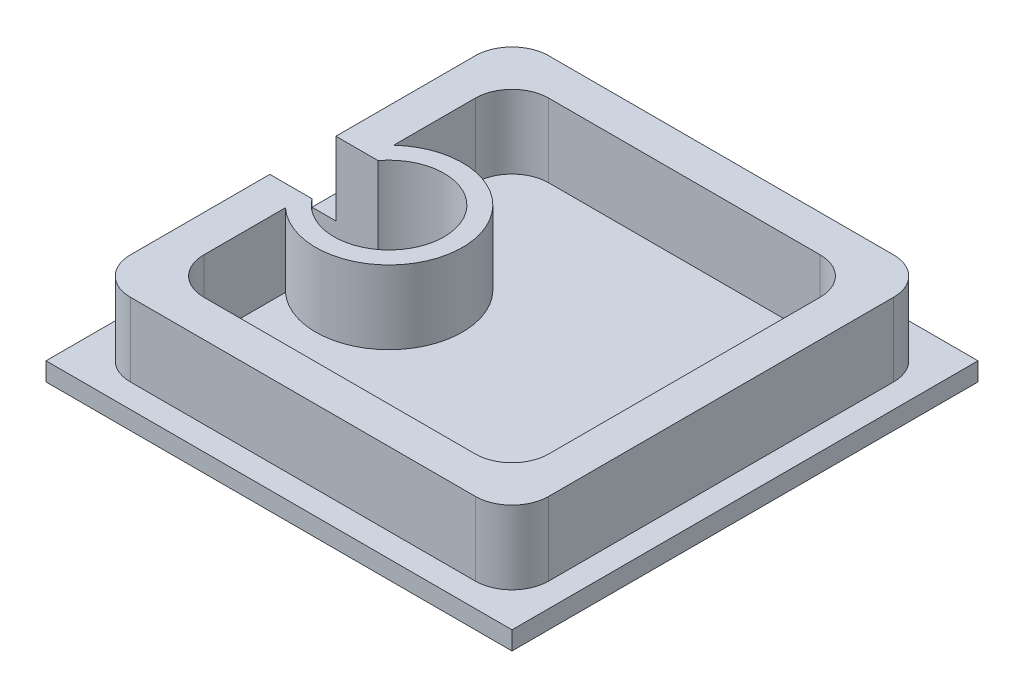
ISO-10303-21;
HEADER;
FILE_DESCRIPTION(('STEP AP214'),'2;1');
FILE_NAME('part.step','',(''),(''),'','','');
FILE_SCHEMA(('AUTOMOTIVE_DESIGN { 1 0 10303 214 1 1 1 1 }'));
ENDSEC;
DATA;
#1=APPLICATION_CONTEXT('core data for automotive mechanical design processes');
#2=APPLICATION_PROTOCOL_DEFINITION('international standard','automotive_design',2000,#1);
#3=PRODUCT_CONTEXT('',#1,'mechanical');
#4=PRODUCT('Part','Part','',(#3));
#5=PRODUCT_RELATED_PRODUCT_CATEGORY('part','',(#4));
#6=PRODUCT_DEFINITION_FORMATION('','',#4);
#7=PRODUCT_DEFINITION_CONTEXT('part definition',#1,'design');
#8=PRODUCT_DEFINITION('design','',#6,#7);
#9=PRODUCT_DEFINITION_SHAPE('','',#8);
#10=(LENGTH_UNIT() NAMED_UNIT(*) SI_UNIT(.MILLI.,.METRE.));
#11=(NAMED_UNIT(*) PLANE_ANGLE_UNIT() SI_UNIT($,.RADIAN.));
#12=(NAMED_UNIT(*) SI_UNIT($,.STERADIAN.) SOLID_ANGLE_UNIT());
#13=UNCERTAINTY_MEASURE_WITH_UNIT(LENGTH_MEASURE(1.E-05),#10,'distance_accuracy_value','');
#14=(GEOMETRIC_REPRESENTATION_CONTEXT(3) GLOBAL_UNCERTAINTY_ASSIGNED_CONTEXT((#13)) GLOBAL_UNIT_ASSIGNED_CONTEXT((#10,
#11,#12)) REPRESENTATION_CONTEXT('',''));
#15=CARTESIAN_POINT('',(0.,0.,0.));
#16=DIRECTION('',(0.,0.,1.));
#17=DIRECTION('',(1.,0.,0.));
#18=AXIS2_PLACEMENT_3D('',#15,#16,#17);
#19=CARTESIAN_POINT('',(-9.40000000000001,5.,-9.40000000000001));
#20=DIRECTION('',(1.,0.,0.));
#21=DIRECTION('',(0.,0.,-1.));
#22=AXIS2_PLACEMENT_3D('',#19,#20,#21);
#23=PLANE('',#22);
#24=DIRECTION('',(0.,0.,1.));
#25=VECTOR('',#24,1.);
#26=CARTESIAN_POINT('',(-9.40000000000001,5.,-9.40000000000001));
#27=LINE('',#26,#25);
#28=CARTESIAN_POINT('',(-9.40000000000001,5.,-7.40000000000001));
#29=VERTEX_POINT('',#28);
#30=CARTESIAN_POINT('',(-9.40000000000001,5.,-2.95127091267474));
#31=VERTEX_POINT('',#30);
#32=EDGE_CURVE('E280',#29,#31,#27,.T.);
#33=ORIENTED_EDGE('',*,*,#32,.T.);
#34=DIRECTION('',(0.,-1.,0.));
#35=VECTOR('',#34,1.);
#36=CARTESIAN_POINT('',(-9.40000000000001,15.435037134577,-2.95127091267474));
#37=LINE('',#36,#35);
#38=CARTESIAN_POINT('',(-9.40000000000001,1.,-2.95127091267474));
#39=VERTEX_POINT('',#38);
#40=EDGE_CURVE('E244',#31,#39,#37,.T.);
#41=ORIENTED_EDGE('',*,*,#40,.T.);
#42=DIRECTION('',(0.,0.,1.));
#43=VECTOR('',#42,1.);
#44=CARTESIAN_POINT('',(-9.40000000000001,1.,-9.40000000000001));
#45=LINE('',#44,#43);
#46=CARTESIAN_POINT('',(-9.40000000000001,1.,-7.40000000000001));
#47=VERTEX_POINT('',#46);
#48=EDGE_CURVE('E293',#47,#39,#45,.T.);
#49=ORIENTED_EDGE('',*,*,#48,.F.);
#50=DIRECTION('',(0.,-1.,0.));
#51=VECTOR('',#50,1.);
#52=CARTESIAN_POINT('',(-9.40000000000001,5.,-7.40000000000001));
#53=LINE('',#52,#51);
#54=EDGE_CURVE('E356',#47,#29,#53,.F.);
#55=ORIENTED_EDGE('',*,*,#54,.T.);
#56=EDGE_LOOP('',(#33,#41,#49,#55));
#57=FACE_BOUND('',#56,.T.);
#58=ADVANCED_FACE('F33',(#57),#23,.T.);
#59=CARTESIAN_POINT('',(0.,1.,0.));
#60=DIRECTION('',(0.,1.,0.));
#61=DIRECTION('',(0.,0.,1.));
#62=AXIS2_PLACEMENT_3D('',#59,#60,#61);
#63=PLANE('',#62);
#64=ORIENTED_EDGE('',*,*,#48,.T.);
#65=CARTESIAN_POINT('',(-6.70000000000001,1.,0.));
#66=DIRECTION('',(0.,1.,0.));
#67=DIRECTION('',(0.,0.,1.));
#68=AXIS2_PLACEMENT_3D('',#65,#66,#67);
#69=CIRCLE('',#68,4.);
#70=CARTESIAN_POINT('',(-9.40000000000001,1.,2.95127091267474));
#71=VERTEX_POINT('',#70);
#72=EDGE_CURVE('E249',#71,#39,#69,.T.);
#73=ORIENTED_EDGE('',*,*,#72,.F.);
#74=CARTESIAN_POINT('',(-9.40000000000001,1.,7.40000000000001));
#75=VERTEX_POINT('',#74);
#76=EDGE_CURVE('E292',#71,#75,#45,.T.);
#77=ORIENTED_EDGE('',*,*,#76,.T.);
#78=CARTESIAN_POINT('',(-7.40000000000001,1.,7.40000000000001));
#79=DIRECTION('',(0.,1.,0.));
#80=DIRECTION('',(0.,0.,1.));
#81=AXIS2_PLACEMENT_3D('',#78,#79,#80);
#82=CIRCLE('',#81,2.);
#83=CARTESIAN_POINT('',(-7.40000000000001,1.,9.40000000000001));
#84=VERTEX_POINT('',#83);
#85=EDGE_CURVE('E367',#75,#84,#82,.T.);
#86=ORIENTED_EDGE('',*,*,#85,.T.);
#87=DIRECTION('',(1.,0.,0.));
#88=VECTOR('',#87,1.);
#89=CARTESIAN_POINT('',(-9.40000000000001,1.,9.40000000000001));
#90=LINE('',#89,#88);
#91=CARTESIAN_POINT('',(7.40000000000001,1.,9.40000000000001));
#92=VERTEX_POINT('',#91);
#93=EDGE_CURVE('E296',#84,#92,#90,.T.);
#94=ORIENTED_EDGE('',*,*,#93,.T.);
#95=CARTESIAN_POINT('',(7.40000000000001,1.,7.40000000000001));
#96=DIRECTION('',(0.,1.,0.));
#97=DIRECTION('',(0.,0.,1.));
#98=AXIS2_PLACEMENT_3D('',#95,#96,#97);
#99=CIRCLE('',#98,2.);
#100=CARTESIAN_POINT('',(9.40000000000001,1.,7.40000000000001));
#101=VERTEX_POINT('',#100);
#102=EDGE_CURVE('E365',#92,#101,#99,.T.);
#103=ORIENTED_EDGE('',*,*,#102,.T.);
#104=DIRECTION('',(0.,0.,-1.));
#105=VECTOR('',#104,1.);
#106=CARTESIAN_POINT('',(9.40000000000001,1.,-9.40000000000001));
#107=LINE('',#106,#105);
#108=CARTESIAN_POINT('',(9.40000000000001,1.,-7.40000000000001));
#109=VERTEX_POINT('',#108);
#110=EDGE_CURVE('E279',#101,#109,#107,.T.);
#111=ORIENTED_EDGE('',*,*,#110,.T.);
#112=CARTESIAN_POINT('',(7.40000000000001,1.,-7.40000000000001));
#113=DIRECTION('',(0.,1.,0.));
#114=DIRECTION('',(0.,0.,1.));
#115=AXIS2_PLACEMENT_3D('',#112,#113,#114);
#116=CIRCLE('',#115,2.);
#117=CARTESIAN_POINT('',(7.40000000000001,1.,-9.40000000000001));
#118=VERTEX_POINT('',#117);
#119=EDGE_CURVE('E363',#109,#118,#116,.T.);
#120=ORIENTED_EDGE('',*,*,#119,.T.);
#121=DIRECTION('',(-1.,0.,0.));
#122=VECTOR('',#121,1.);
#123=CARTESIAN_POINT('',(-9.40000000000001,1.,-9.40000000000001));
#124=LINE('',#123,#122);
#125=CARTESIAN_POINT('',(-7.40000000000001,1.,-9.40000000000001));
#126=VERTEX_POINT('',#125);
#127=EDGE_CURVE('E274',#118,#126,#124,.T.);
#128=ORIENTED_EDGE('',*,*,#127,.T.);
#129=CARTESIAN_POINT('',(-7.40000000000001,1.,-7.40000000000001));
#130=DIRECTION('',(0.,1.,0.));
#131=DIRECTION('',(0.,0.,1.));
#132=AXIS2_PLACEMENT_3D('',#129,#130,#131);
#133=CIRCLE('',#132,2.);
#134=EDGE_CURVE('E361',#126,#47,#133,.T.);
#135=ORIENTED_EDGE('',*,*,#134,.T.);
#136=EDGE_LOOP('',(#64,#73,#77,#86,#94,#103,#111,#120,#128,#135));
#137=FACE_BOUND('',#136,.T.);
#138=ADVANCED_FACE('F486',(#137),#63,.T.);
#139=ORIENTED_EDGE('',*,*,#76,.F.);
#140=DIRECTION('',(0.,-1.,0.));
#141=VECTOR('',#140,1.);
#142=CARTESIAN_POINT('',(-9.40000000000001,15.435037134577,2.95127091267474));
#143=LINE('',#142,#141);
#144=CARTESIAN_POINT('',(-9.40000000000001,5.,2.95127091267474));
#145=VERTEX_POINT('',#144);
#146=EDGE_CURVE('E253',#145,#71,#143,.T.);
#147=ORIENTED_EDGE('',*,*,#146,.F.);
#148=CARTESIAN_POINT('',(-9.40000000000001,5.,7.40000000000001));
#149=VERTEX_POINT('',#148);
#150=EDGE_CURVE('E278',#145,#149,#27,.T.);
#151=ORIENTED_EDGE('',*,*,#150,.T.);
#152=DIRECTION('',(0.,-1.,0.));
#153=VECTOR('',#152,1.);
#154=CARTESIAN_POINT('',(-9.40000000000001,1.,7.40000000000001));
#155=LINE('',#154,#153);
#156=EDGE_CURVE('E358',#149,#75,#155,.T.);
#157=ORIENTED_EDGE('',*,*,#156,.T.);
#158=EDGE_LOOP('',(#139,#147,#151,#157));
#159=FACE_BOUND('',#158,.T.);
#160=ADVANCED_FACE('F489',(#159),#23,.T.);
#161=DIRECTION('',(0.,0.,1.));
#162=VECTOR('',#161,1.);
#163=CARTESIAN_POINT('',(-12.7,1.,12.7));
#164=LINE('',#163,#162);
#165=CARTESIAN_POINT('',(-12.7,1.,-12.7));
#166=VERTEX_POINT('',#165);
#167=CARTESIAN_POINT('',(-12.7,1.,-1.8));
#168=VERTEX_POINT('',#167);
#169=EDGE_CURVE('E325',#166,#168,#164,.T.);
#170=ORIENTED_EDGE('',*,*,#169,.T.);
#171=DIRECTION('',(1.,0.,0.));
#172=VECTOR('',#171,1.);
#173=CARTESIAN_POINT('',(0.,1.,-1.8));
#174=LINE('',#173,#172);
#175=CARTESIAN_POINT('',(-11.4,1.,-1.8));
#176=VERTEX_POINT('',#175);
#177=EDGE_CURVE('E271',#168,#176,#174,.T.);
#178=ORIENTED_EDGE('',*,*,#177,.T.);
#179=DIRECTION('',(0.,0.,1.));
#180=VECTOR('',#179,1.);
#181=CARTESIAN_POINT('',(-11.4,1.,-11.4));
#182=LINE('',#181,#180);
#183=CARTESIAN_POINT('',(-11.4,1.,-9.40000000000001));
#184=VERTEX_POINT('',#183);
#185=EDGE_CURVE('E320',#184,#176,#182,.T.);
#186=ORIENTED_EDGE('',*,*,#185,.F.);
#187=CARTESIAN_POINT('',(-9.40000000000001,1.,-9.40000000000001));
#188=DIRECTION('',(0.,1.,0.));
#189=DIRECTION('',(0.,0.,1.));
#190=AXIS2_PLACEMENT_3D('',#187,#188,#189);
#191=CIRCLE('',#190,2.);
#192=CARTESIAN_POINT('',(-9.40000000000001,1.,-11.4));
#193=VERTEX_POINT('',#192);
#194=EDGE_CURVE('E11',#184,#193,#191,.F.);
#195=ORIENTED_EDGE('',*,*,#194,.T.);
#196=DIRECTION('',(-1.,0.,0.));
#197=VECTOR('',#196,1.);
#198=CARTESIAN_POINT('',(-11.4,1.,-11.4));
#199=LINE('',#198,#197);
#200=CARTESIAN_POINT('',(9.40000000000001,1.,-11.4));
#201=VERTEX_POINT('',#200);
#202=EDGE_CURVE('E317',#201,#193,#199,.T.);
#203=ORIENTED_EDGE('',*,*,#202,.F.);
#204=CARTESIAN_POINT('',(9.40000000000001,1.,-9.40000000000001));
#205=DIRECTION('',(0.,1.,0.));
#206=DIRECTION('',(0.,0.,1.));
#207=AXIS2_PLACEMENT_3D('',#204,#205,#206);
#208=CIRCLE('',#207,2.);
#209=CARTESIAN_POINT('',(11.4,1.,-9.40000000000001));
#210=VERTEX_POINT('',#209);
#211=EDGE_CURVE('E41',#201,#210,#208,.F.);
#212=ORIENTED_EDGE('',*,*,#211,.T.);
#213=DIRECTION('',(0.,0.,-1.));
#214=VECTOR('',#213,1.);
#215=CARTESIAN_POINT('',(11.4,1.,-11.4));
#216=LINE('',#215,#214);
#217=CARTESIAN_POINT('',(11.4,1.,9.40000000000001));
#218=VERTEX_POINT('',#217);
#219=EDGE_CURVE('E289',#218,#210,#216,.T.);
#220=ORIENTED_EDGE('',*,*,#219,.F.);
#221=CARTESIAN_POINT('',(9.40000000000001,1.,9.40000000000001));
#222=DIRECTION('',(0.,1.,0.));
#223=DIRECTION('',(0.,0.,1.));
#224=AXIS2_PLACEMENT_3D('',#221,#222,#223);
#225=CIRCLE('',#224,2.);
#226=CARTESIAN_POINT('',(9.40000000000001,1.,11.4));
#227=VERTEX_POINT('',#226);
#228=EDGE_CURVE('E424',#218,#227,#225,.F.);
#229=ORIENTED_EDGE('',*,*,#228,.T.);
#230=DIRECTION('',(1.,0.,0.));
#231=VECTOR('',#230,1.);
#232=CARTESIAN_POINT('',(-11.4,1.,11.4));
#233=LINE('',#232,#231);
#234=CARTESIAN_POINT('',(-9.40000000000001,1.,11.4));
#235=VERTEX_POINT('',#234);
#236=EDGE_CURVE('E305',#235,#227,#233,.T.);
#237=ORIENTED_EDGE('',*,*,#236,.F.);
#238=CARTESIAN_POINT('',(-9.40000000000001,1.,9.40000000000001));
#239=DIRECTION('',(0.,1.,0.));
#240=DIRECTION('',(0.,0.,1.));
#241=AXIS2_PLACEMENT_3D('',#238,#239,#240);
#242=CIRCLE('',#241,2.);
#243=CARTESIAN_POINT('',(-11.4,1.,9.40000000000001));
#244=VERTEX_POINT('',#243);
#245=EDGE_CURVE('E421',#235,#244,#242,.F.);
#246=ORIENTED_EDGE('',*,*,#245,.T.);
#247=CARTESIAN_POINT('',(-11.4,1.,1.8));
#248=VERTEX_POINT('',#247);
#249=EDGE_CURVE('E319',#248,#244,#182,.T.);
#250=ORIENTED_EDGE('',*,*,#249,.F.);
#251=DIRECTION('',(1.,0.,0.));
#252=VECTOR('',#251,1.);
#253=CARTESIAN_POINT('',(0.,1.,1.8));
#254=LINE('',#253,#252);
#255=CARTESIAN_POINT('',(-12.7,1.,1.8));
#256=VERTEX_POINT('',#255);
#257=EDGE_CURVE('E267',#256,#248,#254,.T.);
#258=ORIENTED_EDGE('',*,*,#257,.F.);
#259=CARTESIAN_POINT('',(-12.7,1.,12.7));
#260=VERTEX_POINT('',#259);
#261=EDGE_CURVE('E329',#256,#260,#164,.T.);
#262=ORIENTED_EDGE('',*,*,#261,.T.);
#263=DIRECTION('',(1.,0.,0.));
#264=VECTOR('',#263,1.);
#265=CARTESIAN_POINT('',(12.7,1.,12.7));
#266=LINE('',#265,#264);
#267=CARTESIAN_POINT('',(12.7,1.,12.7));
#268=VERTEX_POINT('',#267);
#269=EDGE_CURVE('E328',#260,#268,#266,.T.);
#270=ORIENTED_EDGE('',*,*,#269,.T.);
#271=DIRECTION('',(0.,0.,-1.));
#272=VECTOR('',#271,1.);
#273=CARTESIAN_POINT('',(12.7,1.,12.7));
#274=LINE('',#273,#272);
#275=CARTESIAN_POINT('',(12.7,1.,-12.7));
#276=VERTEX_POINT('',#275);
#277=EDGE_CURVE('E331',#268,#276,#274,.T.);
#278=ORIENTED_EDGE('',*,*,#277,.T.);
#279=DIRECTION('',(-1.,0.,0.));
#280=VECTOR('',#279,1.);
#281=CARTESIAN_POINT('',(12.7,1.,-12.7));
#282=LINE('',#281,#280);
#283=EDGE_CURVE('E333',#276,#166,#282,.T.);
#284=ORIENTED_EDGE('',*,*,#283,.T.);
#285=EDGE_LOOP('',(#170,#178,#186,#195,#203,#212,#220,#229,#237,#246,#250,#258,#262,#270,#278,#284));
#286=FACE_BOUND('',#285,.T.);
#287=ADVANCED_FACE('F426',(#286),#63,.T.);
#288=CARTESIAN_POINT('',(-12.7,1.,12.7));
#289=DIRECTION('',(1.,0.,0.));
#290=DIRECTION('',(0.,0.,-1.));
#291=AXIS2_PLACEMENT_3D('',#288,#289,#290);
#292=PLANE('',#291);
#293=DIRECTION('',(0.,1.,0.));
#294=VECTOR('',#293,1.);
#295=CARTESIAN_POINT('',(-12.7,0.,-1.8));
#296=LINE('',#295,#294);
#297=CARTESIAN_POINT('',(-12.7,0.,-1.8));
#298=VERTEX_POINT('',#297);
#299=EDGE_CURVE('E261',#298,#168,#296,.T.);
#300=ORIENTED_EDGE('',*,*,#299,.T.);
#301=ORIENTED_EDGE('',*,*,#169,.F.);
#302=DIRECTION('',(0.,-1.,0.));
#303=VECTOR('',#302,1.);
#304=CARTESIAN_POINT('',(-12.7,1.,-12.7));
#305=LINE('',#304,#303);
#306=CARTESIAN_POINT('',(-12.7,0.,-12.7));
#307=VERTEX_POINT('',#306);
#308=EDGE_CURVE('E335',#166,#307,#305,.T.);
#309=ORIENTED_EDGE('',*,*,#308,.T.);
#310=DIRECTION('',(0.,0.,1.));
#311=VECTOR('',#310,1.);
#312=CARTESIAN_POINT('',(-12.7,0.,12.7));
#313=LINE('',#312,#311);
#314=EDGE_CURVE('E336',#307,#298,#313,.T.);
#315=ORIENTED_EDGE('',*,*,#314,.T.);
#316=EDGE_LOOP('',(#300,#301,#309,#315));
#317=FACE_BOUND('',#316,.T.);
#318=ADVANCED_FACE('F450',(#317),#292,.F.);
#319=CARTESIAN_POINT('',(0.,0.,0.));
#320=DIRECTION('',(0.,1.,0.));
#321=DIRECTION('',(0.,0.,1.));
#322=AXIS2_PLACEMENT_3D('',#319,#320,#321);
#323=PLANE('',#322);
#324=DIRECTION('',(1.,0.,0.));
#325=VECTOR('',#324,1.);
#326=CARTESIAN_POINT('',(0.,0.,-1.8));
#327=LINE('',#326,#325);
#328=CARTESIAN_POINT('',(-9.10000000000001,0.,-1.8));
#329=VERTEX_POINT('',#328);
#330=EDGE_CURVE('E258',#298,#329,#327,.T.);
#331=ORIENTED_EDGE('',*,*,#330,.F.);
#332=ORIENTED_EDGE('',*,*,#314,.F.);
#333=DIRECTION('',(-1.,0.,0.));
#334=VECTOR('',#333,1.);
#335=CARTESIAN_POINT('',(12.7,0.,-12.7));
#336=LINE('',#335,#334);
#337=CARTESIAN_POINT('',(12.7,0.,-12.7));
#338=VERTEX_POINT('',#337);
#339=EDGE_CURVE('E343',#338,#307,#336,.T.);
#340=ORIENTED_EDGE('',*,*,#339,.F.);
#341=DIRECTION('',(0.,0.,-1.));
#342=VECTOR('',#341,1.);
#343=CARTESIAN_POINT('',(12.7,0.,12.7));
#344=LINE('',#343,#342);
#345=CARTESIAN_POINT('',(12.7,0.,12.7));
#346=VERTEX_POINT('',#345);
#347=EDGE_CURVE('E341',#346,#338,#344,.T.);
#348=ORIENTED_EDGE('',*,*,#347,.F.);
#349=DIRECTION('',(1.,0.,0.));
#350=VECTOR('',#349,1.);
#351=CARTESIAN_POINT('',(12.7,0.,12.7));
#352=LINE('',#351,#350);
#353=CARTESIAN_POINT('',(-12.7,0.,12.7));
#354=VERTEX_POINT('',#353);
#355=EDGE_CURVE('E339',#354,#346,#352,.T.);
#356=ORIENTED_EDGE('',*,*,#355,.F.);
#357=CARTESIAN_POINT('',(-12.7,0.,1.8));
#358=VERTEX_POINT('',#357);
#359=EDGE_CURVE('E314',#358,#354,#313,.T.);
#360=ORIENTED_EDGE('',*,*,#359,.F.);
#361=DIRECTION('',(1.,0.,0.));
#362=VECTOR('',#361,1.);
#363=CARTESIAN_POINT('',(0.,0.,1.8));
#364=LINE('',#363,#362);
#365=CARTESIAN_POINT('',(-9.10000000000001,0.,1.8));
#366=VERTEX_POINT('',#365);
#367=EDGE_CURVE('E255',#358,#366,#364,.T.);
#368=ORIENTED_EDGE('',*,*,#367,.T.);
#369=CARTESIAN_POINT('',(-6.70000000000001,0.,0.));
#370=DIRECTION('',(0.,1.,0.));
#371=DIRECTION('',(0.,0.,1.));
#372=AXIS2_PLACEMENT_3D('',#369,#370,#371);
#373=CIRCLE('',#372,3.);
#374=EDGE_CURVE('E235',#366,#329,#373,.T.);
#375=ORIENTED_EDGE('',*,*,#374,.T.);
#376=EDGE_LOOP('',(#331,#332,#340,#348,#356,#360,#368,#375));
#377=FACE_BOUND('',#376,.T.);
#378=ADVANCED_FACE('F454',(#377),#323,.F.);
#379=CARTESIAN_POINT('',(0.,5.,0.));
#380=DIRECTION('',(0.,1.,0.));
#381=DIRECTION('',(0.,0.,1.));
#382=AXIS2_PLACEMENT_3D('',#379,#380,#381);
#383=PLANE('',#382);
#384=DIRECTION('',(1.,0.,0.));
#385=VECTOR('',#384,1.);
#386=CARTESIAN_POINT('',(0.,5.,-1.8));
#387=LINE('',#386,#385);
#388=CARTESIAN_POINT('',(-11.4,5.,-1.8));
#389=VERTEX_POINT('',#388);
#390=CARTESIAN_POINT('',(-9.10000000000001,5.,-1.8));
#391=VERTEX_POINT('',#390);
#392=EDGE_CURVE('E226',#389,#391,#387,.T.);
#393=ORIENTED_EDGE('',*,*,#392,.T.);
#394=CARTESIAN_POINT('',(-6.70000000000001,5.,0.));
#395=DIRECTION('',(0.,1.,0.));
#396=DIRECTION('',(0.,0.,1.));
#397=AXIS2_PLACEMENT_3D('',#394,#395,#396);
#398=CIRCLE('',#397,3.);
#399=CARTESIAN_POINT('',(-9.10000000000001,5.,1.8));
#400=VERTEX_POINT('',#399);
#401=EDGE_CURVE('E233',#391,#400,#398,.F.);
#402=ORIENTED_EDGE('',*,*,#401,.T.);
#403=DIRECTION('',(1.,0.,0.));
#404=VECTOR('',#403,1.);
#405=CARTESIAN_POINT('',(0.,5.,1.8));
#406=LINE('',#405,#404);
#407=CARTESIAN_POINT('',(-11.4,5.,1.8));
#408=VERTEX_POINT('',#407);
#409=EDGE_CURVE('E216',#408,#400,#406,.T.);
#410=ORIENTED_EDGE('',*,*,#409,.F.);
#411=DIRECTION('',(0.,0.,1.));
#412=VECTOR('',#411,1.);
#413=CARTESIAN_POINT('',(-11.4,5.,-11.4));
#414=LINE('',#413,#412);
#415=CARTESIAN_POINT('',(-11.4,5.,9.40000000000001));
#416=VERTEX_POINT('',#415);
#417=EDGE_CURVE('E308',#408,#416,#414,.T.);
#418=ORIENTED_EDGE('',*,*,#417,.T.);
#419=CARTESIAN_POINT('',(-9.40000000000001,5.,9.40000000000001));
#420=DIRECTION('',(0.,1.,0.));
#421=DIRECTION('',(0.,0.,1.));
#422=AXIS2_PLACEMENT_3D('',#419,#420,#421);
#423=CIRCLE('',#422,2.);
#424=CARTESIAN_POINT('',(-9.40000000000001,5.,11.4));
#425=VERTEX_POINT('',#424);
#426=EDGE_CURVE('E401',#416,#425,#423,.T.);
#427=ORIENTED_EDGE('',*,*,#426,.T.);
#428=DIRECTION('',(1.,0.,0.));
#429=VECTOR('',#428,1.);
#430=CARTESIAN_POINT('',(-11.4,5.,11.4));
#431=LINE('',#430,#429);
#432=CARTESIAN_POINT('',(9.40000000000001,5.,11.4));
#433=VERTEX_POINT('',#432);
#434=EDGE_CURVE('E311',#425,#433,#431,.T.);
#435=ORIENTED_EDGE('',*,*,#434,.T.);
#436=CARTESIAN_POINT('',(9.40000000000001,5.,9.40000000000001));
#437=DIRECTION('',(0.,1.,0.));
#438=DIRECTION('',(0.,0.,1.));
#439=AXIS2_PLACEMENT_3D('',#436,#437,#438);
#440=CIRCLE('',#439,2.);
#441=CARTESIAN_POINT('',(11.4,5.,9.40000000000001));
#442=VERTEX_POINT('',#441);
#443=EDGE_CURVE('E399',#433,#442,#440,.T.);
#444=ORIENTED_EDGE('',*,*,#443,.T.);
#445=DIRECTION('',(0.,0.,-1.));
#446=VECTOR('',#445,1.);
#447=CARTESIAN_POINT('',(11.4,5.,-11.4));
#448=LINE('',#447,#446);
#449=CARTESIAN_POINT('',(11.4,5.,-9.40000000000001));
#450=VERTEX_POINT('',#449);
#451=EDGE_CURVE('E301',#442,#450,#448,.T.);
#452=ORIENTED_EDGE('',*,*,#451,.T.);
#453=CARTESIAN_POINT('',(9.40000000000001,5.,-9.40000000000001));
#454=DIRECTION('',(0.,1.,0.));
#455=DIRECTION('',(0.,0.,1.));
#456=AXIS2_PLACEMENT_3D('',#453,#454,#455);
#457=CIRCLE('',#456,2.);
#458=CARTESIAN_POINT('',(9.40000000000001,5.,-11.4));
#459=VERTEX_POINT('',#458);
#460=EDGE_CURVE('E397',#450,#459,#457,.T.);
#461=ORIENTED_EDGE('',*,*,#460,.T.);
#462=DIRECTION('',(-1.,0.,0.));
#463=VECTOR('',#462,1.);
#464=CARTESIAN_POINT('',(-11.4,5.,-11.4));
#465=LINE('',#464,#463);
#466=CARTESIAN_POINT('',(-9.40000000000001,5.,-11.4));
#467=VERTEX_POINT('',#466);
#468=EDGE_CURVE('E304',#459,#467,#465,.T.);
#469=ORIENTED_EDGE('',*,*,#468,.T.);
#470=CARTESIAN_POINT('',(-9.40000000000001,5.,-9.40000000000001));
#471=DIRECTION('',(0.,1.,0.));
#472=DIRECTION('',(0.,0.,1.));
#473=AXIS2_PLACEMENT_3D('',#470,#471,#472);
#474=CIRCLE('',#473,2.);
#475=CARTESIAN_POINT('',(-11.4,5.,-9.40000000000001));
#476=VERTEX_POINT('',#475);
#477=EDGE_CURVE('E395',#467,#476,#474,.T.);
#478=ORIENTED_EDGE('',*,*,#477,.T.);
#479=EDGE_CURVE('E309',#476,#389,#414,.T.);
#480=ORIENTED_EDGE('',*,*,#479,.T.);
#481=EDGE_LOOP('',(#393,#402,#410,#418,#427,#435,#444,#452,#461,#469,#478,#480));
#482=FACE_BOUND('',#481,.T.);
#483=CARTESIAN_POINT('',(-6.70000000000001,5.,0.));
#484=DIRECTION('',(0.,1.,0.));
#485=DIRECTION('',(0.,0.,1.));
#486=AXIS2_PLACEMENT_3D('',#483,#484,#485);
#487=CIRCLE('',#486,4.);
#488=EDGE_CURVE('E227',#145,#31,#487,.T.);
#489=ORIENTED_EDGE('',*,*,#488,.T.);
#490=ORIENTED_EDGE('',*,*,#32,.F.);
#491=CARTESIAN_POINT('',(-7.40000000000001,5.,-7.40000000000001));
#492=DIRECTION('',(0.,1.,0.));
#493=DIRECTION('',(0.,0.,1.));
#494=AXIS2_PLACEMENT_3D('',#491,#492,#493);
#495=CIRCLE('',#494,2.);
#496=CARTESIAN_POINT('',(-7.40000000000001,5.,-9.40000000000001));
#497=VERTEX_POINT('',#496);
#498=EDGE_CURVE('E419',#29,#497,#495,.F.);
#499=ORIENTED_EDGE('',*,*,#498,.T.);
#500=DIRECTION('',(-1.,0.,0.));
#501=VECTOR('',#500,1.);
#502=CARTESIAN_POINT('',(-9.40000000000001,5.,-9.40000000000001));
#503=LINE('',#502,#501);
#504=CARTESIAN_POINT('',(7.40000000000001,5.,-9.40000000000001));
#505=VERTEX_POINT('',#504);
#506=EDGE_CURVE('E275',#505,#497,#503,.T.);
#507=ORIENTED_EDGE('',*,*,#506,.F.);
#508=CARTESIAN_POINT('',(7.40000000000001,5.,-7.40000000000001));
#509=DIRECTION('',(0.,1.,0.));
#510=DIRECTION('',(0.,0.,1.));
#511=AXIS2_PLACEMENT_3D('',#508,#509,#510);
#512=CIRCLE('',#511,2.);
#513=CARTESIAN_POINT('',(9.40000000000001,5.,-7.40000000000001));
#514=VERTEX_POINT('',#513);
#515=EDGE_CURVE('E417',#505,#514,#512,.F.);
#516=ORIENTED_EDGE('',*,*,#515,.T.);
#517=DIRECTION('',(0.,0.,-1.));
#518=VECTOR('',#517,1.);
#519=CARTESIAN_POINT('',(9.40000000000001,5.,-9.40000000000001));
#520=LINE('',#519,#518);
#521=CARTESIAN_POINT('',(9.40000000000001,5.,7.40000000000001));
#522=VERTEX_POINT('',#521);
#523=EDGE_CURVE('E286',#522,#514,#520,.T.);
#524=ORIENTED_EDGE('',*,*,#523,.F.);
#525=CARTESIAN_POINT('',(7.40000000000001,5.,7.40000000000001));
#526=DIRECTION('',(0.,1.,0.));
#527=DIRECTION('',(0.,0.,1.));
#528=AXIS2_PLACEMENT_3D('',#525,#526,#527);
#529=CIRCLE('',#528,2.);
#530=CARTESIAN_POINT('',(7.40000000000001,5.,9.40000000000001));
#531=VERTEX_POINT('',#530);
#532=EDGE_CURVE('E415',#522,#531,#529,.F.);
#533=ORIENTED_EDGE('',*,*,#532,.T.);
#534=DIRECTION('',(1.,0.,0.));
#535=VECTOR('',#534,1.);
#536=CARTESIAN_POINT('',(-9.40000000000001,5.,9.40000000000001));
#537=LINE('',#536,#535);
#538=CARTESIAN_POINT('',(-7.40000000000001,5.,9.40000000000001));
#539=VERTEX_POINT('',#538);
#540=EDGE_CURVE('E283',#539,#531,#537,.T.);
#541=ORIENTED_EDGE('',*,*,#540,.F.);
#542=CARTESIAN_POINT('',(-7.40000000000001,5.,7.40000000000001));
#543=DIRECTION('',(0.,1.,0.));
#544=DIRECTION('',(0.,0.,1.));
#545=AXIS2_PLACEMENT_3D('',#542,#543,#544);
#546=CIRCLE('',#545,2.);
#547=EDGE_CURVE('E412',#539,#149,#546,.F.);
#548=ORIENTED_EDGE('',*,*,#547,.T.);
#549=ORIENTED_EDGE('',*,*,#150,.F.);
#550=EDGE_LOOP('',(#489,#490,#499,#507,#516,#524,#533,#541,#548,#549));
#551=FACE_BOUND('',#550,.T.);
#552=ADVANCED_FACE('F240',(#482,#551),#383,.T.);
#553=CARTESIAN_POINT('',(-11.4,5.,-11.4));
#554=DIRECTION('',(1.,0.,0.));
#555=DIRECTION('',(0.,0.,-1.));
#556=AXIS2_PLACEMENT_3D('',#553,#554,#555);
#557=PLANE('',#556);
#558=DIRECTION('',(0.,-1.,0.));
#559=VECTOR('',#558,1.);
#560=CARTESIAN_POINT('',(-11.4,5.,-1.8));
#561=LINE('',#560,#559);
#562=EDGE_CURVE('E269',#389,#176,#561,.T.);
#563=ORIENTED_EDGE('',*,*,#562,.F.);
#564=ORIENTED_EDGE('',*,*,#479,.F.);
#565=DIRECTION('',(0.,-1.,0.));
#566=VECTOR('',#565,1.);
#567=CARTESIAN_POINT('',(-11.4,5.,-9.40000000000001));
#568=LINE('',#567,#566);
#569=EDGE_CURVE('E389',#476,#184,#568,.T.);
#570=ORIENTED_EDGE('',*,*,#569,.T.);
#571=ORIENTED_EDGE('',*,*,#185,.T.);
#572=EDGE_LOOP('',(#563,#564,#570,#571));
#573=FACE_BOUND('',#572,.T.);
#574=ADVANCED_FACE('F443',(#573),#557,.F.);
#575=ORIENTED_EDGE('',*,*,#261,.F.);
#576=DIRECTION('',(0.,1.,0.));
#577=VECTOR('',#576,1.);
#578=CARTESIAN_POINT('',(-12.7,0.,1.8));
#579=LINE('',#578,#577);
#580=EDGE_CURVE('E238',#358,#256,#579,.T.);
#581=ORIENTED_EDGE('',*,*,#580,.F.);
#582=ORIENTED_EDGE('',*,*,#359,.T.);
#583=DIRECTION('',(0.,-1.,0.));
#584=VECTOR('',#583,1.);
#585=CARTESIAN_POINT('',(-12.7,1.,12.7));
#586=LINE('',#585,#584);
#587=EDGE_CURVE('E353',#260,#354,#586,.T.);
#588=ORIENTED_EDGE('',*,*,#587,.F.);
#589=EDGE_LOOP('',(#575,#581,#582,#588));
#590=FACE_BOUND('',#589,.T.);
#591=ADVANCED_FACE('F462',(#590),#292,.F.);
#592=CARTESIAN_POINT('',(12.7,1.,12.7));
#593=DIRECTION('',(0.,0.,-1.));
#594=DIRECTION('',(-1.,0.,0.));
#595=AXIS2_PLACEMENT_3D('',#592,#593,#594);
#596=PLANE('',#595);
#597=ORIENTED_EDGE('',*,*,#355,.T.);
#598=DIRECTION('',(0.,-1.,0.));
#599=VECTOR('',#598,1.);
#600=CARTESIAN_POINT('',(12.7,1.,12.7));
#601=LINE('',#600,#599);
#602=EDGE_CURVE('E350',#268,#346,#601,.T.);
#603=ORIENTED_EDGE('',*,*,#602,.F.);
#604=ORIENTED_EDGE('',*,*,#269,.F.);
#605=ORIENTED_EDGE('',*,*,#587,.T.);
#606=EDGE_LOOP('',(#597,#603,#604,#605));
#607=FACE_BOUND('',#606,.T.);
#608=ADVANCED_FACE('F468',(#607),#596,.F.);
#609=CARTESIAN_POINT('',(12.7,1.,12.7));
#610=DIRECTION('',(-1.,0.,0.));
#611=DIRECTION('',(0.,0.,1.));
#612=AXIS2_PLACEMENT_3D('',#609,#610,#611);
#613=PLANE('',#612);
#614=ORIENTED_EDGE('',*,*,#347,.T.);
#615=DIRECTION('',(0.,-1.,0.));
#616=VECTOR('',#615,1.);
#617=CARTESIAN_POINT('',(12.7,1.,-12.7));
#618=LINE('',#617,#616);
#619=EDGE_CURVE('E347',#276,#338,#618,.T.);
#620=ORIENTED_EDGE('',*,*,#619,.F.);
#621=ORIENTED_EDGE('',*,*,#277,.F.);
#622=ORIENTED_EDGE('',*,*,#602,.T.);
#623=EDGE_LOOP('',(#614,#620,#621,#622));
#624=FACE_BOUND('',#623,.T.);
#625=ADVANCED_FACE('F473',(#624),#613,.F.);
#626=CARTESIAN_POINT('',(12.7,1.,-12.7));
#627=DIRECTION('',(0.,0.,1.));
#628=DIRECTION('',(1.,0.,0.));
#629=AXIS2_PLACEMENT_3D('',#626,#627,#628);
#630=PLANE('',#629);
#631=ORIENTED_EDGE('',*,*,#339,.T.);
#632=ORIENTED_EDGE('',*,*,#308,.F.);
#633=ORIENTED_EDGE('',*,*,#283,.F.);
#634=ORIENTED_EDGE('',*,*,#619,.T.);
#635=EDGE_LOOP('',(#631,#632,#633,#634));
#636=FACE_BOUND('',#635,.T.);
#637=ADVANCED_FACE('F475',(#636),#630,.F.);
#638=CARTESIAN_POINT('',(11.4,5.,-11.4));
#639=DIRECTION('',(-1.,0.,0.));
#640=DIRECTION('',(0.,0.,1.));
#641=AXIS2_PLACEMENT_3D('',#638,#639,#640);
#642=PLANE('',#641);
#643=ORIENTED_EDGE('',*,*,#451,.F.);
#644=DIRECTION('',(0.,-1.,0.));
#645=VECTOR('',#644,1.);
#646=CARTESIAN_POINT('',(11.4,5.,9.40000000000001));
#647=LINE('',#646,#645);
#648=EDGE_CURVE('E405',#442,#218,#647,.T.);
#649=ORIENTED_EDGE('',*,*,#648,.T.);
#650=ORIENTED_EDGE('',*,*,#219,.T.);
#651=DIRECTION('',(0.,-1.,0.));
#652=VECTOR('',#651,1.);
#653=CARTESIAN_POINT('',(11.4,5.,-9.40000000000001));
#654=LINE('',#653,#652);
#655=EDGE_CURVE('E403',#210,#450,#654,.F.);
#656=ORIENTED_EDGE('',*,*,#655,.T.);
#657=EDGE_LOOP('',(#643,#649,#650,#656));
#658=FACE_BOUND('',#657,.T.);
#659=ADVANCED_FACE('F429',(#658),#642,.F.);
#660=CARTESIAN_POINT('',(-11.4,5.,-11.4));
#661=DIRECTION('',(0.,0.,1.));
#662=DIRECTION('',(1.,0.,0.));
#663=AXIS2_PLACEMENT_3D('',#660,#661,#662);
#664=PLANE('',#663);
#665=ORIENTED_EDGE('',*,*,#468,.F.);
#666=DIRECTION('',(0.,-1.,0.));
#667=VECTOR('',#666,1.);
#668=CARTESIAN_POINT('',(9.40000000000001,5.,-11.4));
#669=LINE('',#668,#667);
#670=EDGE_CURVE('E410',#459,#201,#669,.T.);
#671=ORIENTED_EDGE('',*,*,#670,.T.);
#672=ORIENTED_EDGE('',*,*,#202,.T.);
#673=DIRECTION('',(0.,-1.,0.));
#674=VECTOR('',#673,1.);
#675=CARTESIAN_POINT('',(-9.40000000000001,5.,-11.4));
#676=LINE('',#675,#674);
#677=EDGE_CURVE('E408',#193,#467,#676,.F.);
#678=ORIENTED_EDGE('',*,*,#677,.T.);
#679=EDGE_LOOP('',(#665,#671,#672,#678));
#680=FACE_BOUND('',#679,.T.);
#681=ADVANCED_FACE('F436',(#680),#664,.F.);
#682=ORIENTED_EDGE('',*,*,#417,.F.);
#683=DIRECTION('',(0.,-1.,0.));
#684=VECTOR('',#683,1.);
#685=CARTESIAN_POINT('',(-11.4,5.,1.8));
#686=LINE('',#685,#684);
#687=EDGE_CURVE('E222',#408,#248,#686,.T.);
#688=ORIENTED_EDGE('',*,*,#687,.T.);
#689=ORIENTED_EDGE('',*,*,#249,.T.);
#690=DIRECTION('',(0.,-1.,0.));
#691=VECTOR('',#690,1.);
#692=CARTESIAN_POINT('',(-11.4,5.,9.40000000000001));
#693=LINE('',#692,#691);
#694=EDGE_CURVE('E392',#244,#416,#693,.F.);
#695=ORIENTED_EDGE('',*,*,#694,.T.);
#696=EDGE_LOOP('',(#682,#688,#689,#695));
#697=FACE_BOUND('',#696,.T.);
#698=ADVANCED_FACE('F565',(#697),#557,.F.);
#699=CARTESIAN_POINT('',(-11.4,5.,11.4));
#700=DIRECTION('',(0.,0.,-1.));
#701=DIRECTION('',(-1.,0.,0.));
#702=AXIS2_PLACEMENT_3D('',#699,#700,#701);
#703=PLANE('',#702);
#704=ORIENTED_EDGE('',*,*,#434,.F.);
#705=DIRECTION('',(0.,-1.,0.));
#706=VECTOR('',#705,1.);
#707=CARTESIAN_POINT('',(-9.40000000000001,5.,11.4));
#708=LINE('',#707,#706);
#709=EDGE_CURVE('E386',#425,#235,#708,.T.);
#710=ORIENTED_EDGE('',*,*,#709,.T.);
#711=ORIENTED_EDGE('',*,*,#236,.T.);
#712=DIRECTION('',(0.,-1.,0.));
#713=VECTOR('',#712,1.);
#714=CARTESIAN_POINT('',(9.40000000000001,5.,11.4));
#715=LINE('',#714,#713);
#716=EDGE_CURVE('E384',#227,#433,#715,.F.);
#717=ORIENTED_EDGE('',*,*,#716,.T.);
#718=EDGE_LOOP('',(#704,#710,#711,#717));
#719=FACE_BOUND('',#718,.T.);
#720=ADVANCED_FACE('F561',(#719),#703,.F.);
#721=CARTESIAN_POINT('',(-9.40000000000001,5.,-9.40000000000001));
#722=DIRECTION('',(0.,0.,1.));
#723=DIRECTION('',(1.,0.,0.));
#724=AXIS2_PLACEMENT_3D('',#721,#722,#723);
#725=PLANE('',#724);
#726=ORIENTED_EDGE('',*,*,#127,.F.);
#727=DIRECTION('',(0.,-1.,0.));
#728=VECTOR('',#727,1.);
#729=CARTESIAN_POINT('',(7.40000000000001,5.,-9.40000000000001));
#730=LINE('',#729,#728);
#731=EDGE_CURVE('E382',#118,#505,#730,.F.);
#732=ORIENTED_EDGE('',*,*,#731,.T.);
#733=ORIENTED_EDGE('',*,*,#506,.T.);
#734=DIRECTION('',(0.,-1.,0.));
#735=VECTOR('',#734,1.);
#736=CARTESIAN_POINT('',(-7.40000000000001,1.,-9.40000000000001));
#737=LINE('',#736,#735);
#738=EDGE_CURVE('E379',#497,#126,#737,.T.);
#739=ORIENTED_EDGE('',*,*,#738,.T.);
#740=EDGE_LOOP('',(#726,#732,#733,#739));
#741=FACE_BOUND('',#740,.T.);
#742=ADVANCED_FACE('F534',(#741),#725,.T.);
#743=CARTESIAN_POINT('',(-9.40000000000001,5.,9.40000000000001));
#744=DIRECTION('',(0.,0.,-1.));
#745=DIRECTION('',(-1.,0.,0.));
#746=AXIS2_PLACEMENT_3D('',#743,#744,#745);
#747=PLANE('',#746);
#748=ORIENTED_EDGE('',*,*,#93,.F.);
#749=DIRECTION('',(0.,-1.,0.));
#750=VECTOR('',#749,1.);
#751=CARTESIAN_POINT('',(-7.40000000000001,5.,9.40000000000001));
#752=LINE('',#751,#750);
#753=EDGE_CURVE('E372',#84,#539,#752,.F.);
#754=ORIENTED_EDGE('',*,*,#753,.T.);
#755=ORIENTED_EDGE('',*,*,#540,.T.);
#756=DIRECTION('',(0.,-1.,0.));
#757=VECTOR('',#756,1.);
#758=CARTESIAN_POINT('',(7.40000000000001,1.,9.40000000000001));
#759=LINE('',#758,#757);
#760=EDGE_CURVE('E369',#531,#92,#759,.T.);
#761=ORIENTED_EDGE('',*,*,#760,.T.);
#762=EDGE_LOOP('',(#748,#754,#755,#761));
#763=FACE_BOUND('',#762,.T.);
#764=ADVANCED_FACE('F517',(#763),#747,.T.);
#765=CARTESIAN_POINT('',(9.40000000000001,5.,-9.40000000000001));
#766=DIRECTION('',(-1.,0.,0.));
#767=DIRECTION('',(0.,0.,1.));
#768=AXIS2_PLACEMENT_3D('',#765,#766,#767);
#769=PLANE('',#768);
#770=ORIENTED_EDGE('',*,*,#110,.F.);
#771=DIRECTION('',(0.,-1.,0.));
#772=VECTOR('',#771,1.);
#773=CARTESIAN_POINT('',(9.40000000000001,5.,7.40000000000001));
#774=LINE('',#773,#772);
#775=EDGE_CURVE('E377',#101,#522,#774,.F.);
#776=ORIENTED_EDGE('',*,*,#775,.T.);
#777=ORIENTED_EDGE('',*,*,#523,.T.);
#778=DIRECTION('',(0.,-1.,0.));
#779=VECTOR('',#778,1.);
#780=CARTESIAN_POINT('',(9.40000000000001,1.,-7.40000000000001));
#781=LINE('',#780,#779);
#782=EDGE_CURVE('E374',#514,#109,#781,.T.);
#783=ORIENTED_EDGE('',*,*,#782,.T.);
#784=EDGE_LOOP('',(#770,#776,#777,#783));
#785=FACE_BOUND('',#784,.T.);
#786=ADVANCED_FACE('F526',(#785),#769,.T.);
#787=CARTESIAN_POINT('',(-7.40000000000001,5.,7.40000000000001));
#788=DIRECTION('',(0.,1.,0.));
#789=DIRECTION('',(0.,0.,1.));
#790=AXIS2_PLACEMENT_3D('',#787,#788,#789);
#791=CYLINDRICAL_SURFACE('',#790,2.);
#792=ORIENTED_EDGE('',*,*,#547,.F.);
#793=ORIENTED_EDGE('',*,*,#753,.F.);
#794=ORIENTED_EDGE('',*,*,#85,.F.);
#795=ORIENTED_EDGE('',*,*,#156,.F.);
#796=EDGE_LOOP('',(#792,#793,#794,#795));
#797=FACE_BOUND('',#796,.T.);
#798=ADVANCED_FACE('F514',(#797),#791,.F.);
#799=CARTESIAN_POINT('',(7.40000000000001,5.,7.40000000000001));
#800=DIRECTION('',(0.,1.,0.));
#801=DIRECTION('',(0.,0.,1.));
#802=AXIS2_PLACEMENT_3D('',#799,#800,#801);
#803=CYLINDRICAL_SURFACE('',#802,2.);
#804=ORIENTED_EDGE('',*,*,#532,.F.);
#805=ORIENTED_EDGE('',*,*,#775,.F.);
#806=ORIENTED_EDGE('',*,*,#102,.F.);
#807=ORIENTED_EDGE('',*,*,#760,.F.);
#808=EDGE_LOOP('',(#804,#805,#806,#807));
#809=FACE_BOUND('',#808,.T.);
#810=ADVANCED_FACE('F523',(#809),#803,.F.);
#811=CARTESIAN_POINT('',(7.40000000000001,5.,-7.40000000000001));
#812=DIRECTION('',(0.,1.,0.));
#813=DIRECTION('',(0.,0.,1.));
#814=AXIS2_PLACEMENT_3D('',#811,#812,#813);
#815=CYLINDRICAL_SURFACE('',#814,2.);
#816=ORIENTED_EDGE('',*,*,#515,.F.);
#817=ORIENTED_EDGE('',*,*,#731,.F.);
#818=ORIENTED_EDGE('',*,*,#119,.F.);
#819=ORIENTED_EDGE('',*,*,#782,.F.);
#820=EDGE_LOOP('',(#816,#817,#818,#819));
#821=FACE_BOUND('',#820,.T.);
#822=ADVANCED_FACE('F530',(#821),#815,.F.);
#823=CARTESIAN_POINT('',(-7.40000000000001,5.,-7.40000000000001));
#824=DIRECTION('',(0.,1.,0.));
#825=DIRECTION('',(0.,0.,1.));
#826=AXIS2_PLACEMENT_3D('',#823,#824,#825);
#827=CYLINDRICAL_SURFACE('',#826,2.);
#828=ORIENTED_EDGE('',*,*,#498,.F.);
#829=ORIENTED_EDGE('',*,*,#54,.F.);
#830=ORIENTED_EDGE('',*,*,#134,.F.);
#831=ORIENTED_EDGE('',*,*,#738,.F.);
#832=EDGE_LOOP('',(#828,#829,#830,#831));
#833=FACE_BOUND('',#832,.T.);
#834=ADVANCED_FACE('F539',(#833),#827,.F.);
#835=CARTESIAN_POINT('',(-9.40000000000001,5.,9.40000000000001));
#836=DIRECTION('',(0.,-1.,0.));
#837=DIRECTION('',(0.,0.,-1.));
#838=AXIS2_PLACEMENT_3D('',#835,#836,#837);
#839=CYLINDRICAL_SURFACE('',#838,2.);
#840=ORIENTED_EDGE('',*,*,#426,.F.);
#841=ORIENTED_EDGE('',*,*,#694,.F.);
#842=ORIENTED_EDGE('',*,*,#245,.F.);
#843=ORIENTED_EDGE('',*,*,#709,.F.);
#844=EDGE_LOOP('',(#840,#841,#842,#843));
#845=FACE_BOUND('',#844,.T.);
#846=ADVANCED_FACE('F681',(#845),#839,.T.);
#847=CARTESIAN_POINT('',(9.40000000000001,5.,9.40000000000001));
#848=DIRECTION('',(0.,-1.,0.));
#849=DIRECTION('',(0.,0.,-1.));
#850=AXIS2_PLACEMENT_3D('',#847,#848,#849);
#851=CYLINDRICAL_SURFACE('',#850,2.);
#852=ORIENTED_EDGE('',*,*,#443,.F.);
#853=ORIENTED_EDGE('',*,*,#716,.F.);
#854=ORIENTED_EDGE('',*,*,#228,.F.);
#855=ORIENTED_EDGE('',*,*,#648,.F.);
#856=EDGE_LOOP('',(#852,#853,#854,#855));
#857=FACE_BOUND('',#856,.T.);
#858=ADVANCED_FACE('F673',(#857),#851,.T.);
#859=CARTESIAN_POINT('',(9.40000000000001,5.,-9.40000000000001));
#860=DIRECTION('',(0.,-1.,0.));
#861=DIRECTION('',(0.,0.,-1.));
#862=AXIS2_PLACEMENT_3D('',#859,#860,#861);
#863=CYLINDRICAL_SURFACE('',#862,2.);
#864=ORIENTED_EDGE('',*,*,#460,.F.);
#865=ORIENTED_EDGE('',*,*,#655,.F.);
#866=ORIENTED_EDGE('',*,*,#211,.F.);
#867=ORIENTED_EDGE('',*,*,#670,.F.);
#868=EDGE_LOOP('',(#864,#865,#866,#867));
#869=FACE_BOUND('',#868,.T.);
#870=ADVANCED_FACE('F432',(#869),#863,.T.);
#871=CARTESIAN_POINT('',(-9.40000000000001,5.,-9.40000000000001));
#872=DIRECTION('',(0.,-1.,0.));
#873=DIRECTION('',(0.,0.,-1.));
#874=AXIS2_PLACEMENT_3D('',#871,#872,#873);
#875=CYLINDRICAL_SURFACE('',#874,2.);
#876=ORIENTED_EDGE('',*,*,#477,.F.);
#877=ORIENTED_EDGE('',*,*,#677,.F.);
#878=ORIENTED_EDGE('',*,*,#194,.F.);
#879=ORIENTED_EDGE('',*,*,#569,.F.);
#880=EDGE_LOOP('',(#876,#877,#878,#879));
#881=FACE_BOUND('',#880,.T.);
#882=ADVANCED_FACE('F35',(#881),#875,.T.);
#883=CARTESIAN_POINT('',(0.,0.,-1.8));
#884=DIRECTION('',(0.,0.,1.));
#885=DIRECTION('',(1.,0.,0.));
#886=AXIS2_PLACEMENT_3D('',#883,#884,#885);
#887=PLANE('',#886);
#888=ORIENTED_EDGE('',*,*,#299,.F.);
#889=ORIENTED_EDGE('',*,*,#330,.T.);
#890=DIRECTION('',(0.,1.,0.));
#891=VECTOR('',#890,1.);
#892=CARTESIAN_POINT('',(-9.10000000000001,0.,-1.8));
#893=LINE('',#892,#891);
#894=EDGE_CURVE('E237',#329,#391,#893,.T.);
#895=ORIENTED_EDGE('',*,*,#894,.T.);
#896=ORIENTED_EDGE('',*,*,#392,.F.);
#897=ORIENTED_EDGE('',*,*,#562,.T.);
#898=ORIENTED_EDGE('',*,*,#177,.F.);
#899=EDGE_LOOP('',(#888,#889,#895,#896,#897,#898));
#900=FACE_BOUND('',#899,.T.);
#901=ADVANCED_FACE('F445',(#900),#887,.T.);
#902=CARTESIAN_POINT('',(-6.70000000000001,0.,0.));
#903=DIRECTION('',(0.,1.,0.));
#904=DIRECTION('',(0.,0.,1.));
#905=AXIS2_PLACEMENT_3D('',#902,#903,#904);
#906=CYLINDRICAL_SURFACE('',#905,3.);
#907=DIRECTION('',(0.,1.,0.));
#908=VECTOR('',#907,1.);
#909=CARTESIAN_POINT('',(-9.10000000000001,0.,1.8));
#910=LINE('',#909,#908);
#911=EDGE_CURVE('E219',#366,#400,#910,.T.);
#912=ORIENTED_EDGE('',*,*,#911,.T.);
#913=ORIENTED_EDGE('',*,*,#401,.F.);
#914=ORIENTED_EDGE('',*,*,#894,.F.);
#915=ORIENTED_EDGE('',*,*,#374,.F.);
#916=EDGE_LOOP('',(#912,#913,#914,#915));
#917=FACE_BOUND('',#916,.T.);
#918=ADVANCED_FACE('F231',(#917),#906,.F.);
#919=CARTESIAN_POINT('',(0.,0.,1.8));
#920=DIRECTION('',(0.,0.,1.));
#921=DIRECTION('',(1.,0.,0.));
#922=AXIS2_PLACEMENT_3D('',#919,#920,#921);
#923=PLANE('',#922);
#924=ORIENTED_EDGE('',*,*,#257,.T.);
#925=ORIENTED_EDGE('',*,*,#687,.F.);
#926=ORIENTED_EDGE('',*,*,#409,.T.);
#927=ORIENTED_EDGE('',*,*,#911,.F.);
#928=ORIENTED_EDGE('',*,*,#367,.F.);
#929=ORIENTED_EDGE('',*,*,#580,.T.);
#930=EDGE_LOOP('',(#924,#925,#926,#927,#928,#929));
#931=FACE_BOUND('',#930,.T.);
#932=ADVANCED_FACE('F218',(#931),#923,.F.);
#933=CARTESIAN_POINT('',(-6.70000000000001,15.435037134577,0.));
#934=DIRECTION('',(0.,-1.,0.));
#935=DIRECTION('',(0.,0.,-1.));
#936=AXIS2_PLACEMENT_3D('',#933,#934,#935);
#937=CYLINDRICAL_SURFACE('',#936,4.);
#938=ORIENTED_EDGE('',*,*,#488,.F.);
#939=ORIENTED_EDGE('',*,*,#146,.T.);
#940=ORIENTED_EDGE('',*,*,#72,.T.);
#941=ORIENTED_EDGE('',*,*,#40,.F.);
#942=EDGE_LOOP('',(#938,#939,#940,#941));
#943=FACE_BOUND('',#942,.T.);
#944=ADVANCED_FACE('F544',(#943),#937,.T.);
#945=CLOSED_SHELL('',(#58,#138,#160,#287,#318,#378,#552,#574,#591,#608,#625,#637,#659,#681,#698,
#720,#742,#764,#786,#798,#810,#822,#834,#846,#858,#870,#882,#901,#918,#932,#944));
#946=MANIFOLD_SOLID_BREP('B2',#945);
#947=ADVANCED_BREP_SHAPE_REPRESENTATION('',(#18,#946),#14);
#948=SHAPE_DEFINITION_REPRESENTATION(#9,#947);
ENDSEC;
END-ISO-10303-21;
